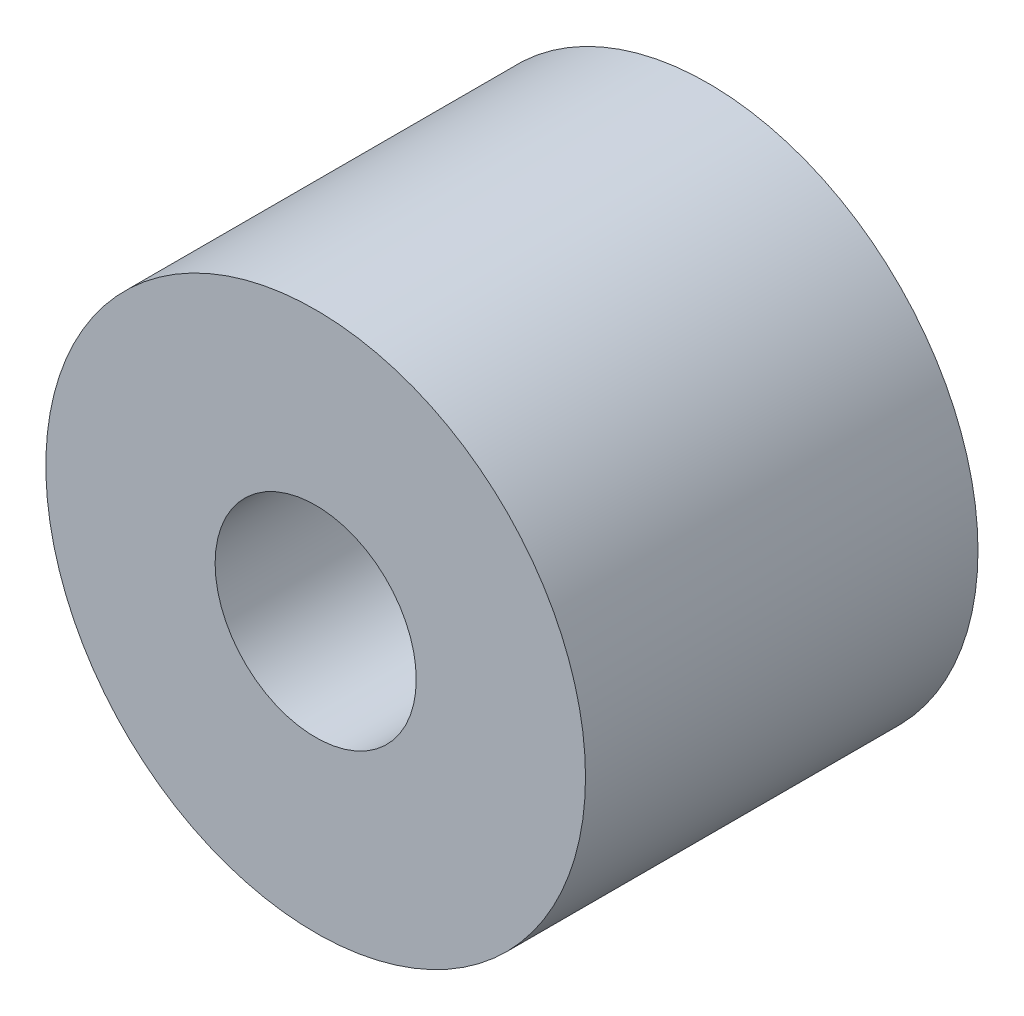
ISO-10303-21;
HEADER;
FILE_DESCRIPTION(('STEP AP214'),'2;1');
FILE_NAME('part.step','',(''),(''),'','','');
FILE_SCHEMA(('AUTOMOTIVE_DESIGN { 1 0 10303 214 1 1 1 1 }'));
ENDSEC;
DATA;
#1=APPLICATION_CONTEXT('core data for automotive mechanical design processes');
#2=APPLICATION_PROTOCOL_DEFINITION('international standard','automotive_design',2000,#1);
#3=PRODUCT_CONTEXT('',#1,'mechanical');
#4=PRODUCT('Part','Part','',(#3));
#5=PRODUCT_RELATED_PRODUCT_CATEGORY('part','',(#4));
#6=PRODUCT_DEFINITION_FORMATION('','',#4);
#7=PRODUCT_DEFINITION_CONTEXT('part definition',#1,'design');
#8=PRODUCT_DEFINITION('design','',#6,#7);
#9=PRODUCT_DEFINITION_SHAPE('','',#8);
#10=(LENGTH_UNIT() NAMED_UNIT(*) SI_UNIT(.MILLI.,.METRE.));
#11=(NAMED_UNIT(*) PLANE_ANGLE_UNIT() SI_UNIT($,.RADIAN.));
#12=(NAMED_UNIT(*) SI_UNIT($,.STERADIAN.) SOLID_ANGLE_UNIT());
#13=UNCERTAINTY_MEASURE_WITH_UNIT(LENGTH_MEASURE(1.E-05),#10,'distance_accuracy_value','');
#14=(GEOMETRIC_REPRESENTATION_CONTEXT(3) GLOBAL_UNCERTAINTY_ASSIGNED_CONTEXT((#13)) GLOBAL_UNIT_ASSIGNED_CONTEXT((#10,
#11,#12)) REPRESENTATION_CONTEXT('',''));
#15=CARTESIAN_POINT('',(0.,0.,0.));
#16=DIRECTION('',(0.,0.,1.));
#17=DIRECTION('',(1.,0.,0.));
#18=AXIS2_PLACEMENT_3D('',#15,#16,#17);
#19=CARTESIAN_POINT('',(0.,0.,8.));
#20=DIRECTION('',(0.,0.,1.));
#21=DIRECTION('',(1.,0.,0.));
#22=AXIS2_PLACEMENT_3D('',#19,#20,#21);
#23=PLANE('',#22);
#24=CARTESIAN_POINT('',(0.,0.,8.));
#25=DIRECTION('',(0.,0.,1.));
#26=DIRECTION('',(1.,0.,0.));
#27=AXIS2_PLACEMENT_3D('',#24,#25,#26);
#28=CIRCLE('',#27,5.5);
#29=CARTESIAN_POINT('',(5.5,0.,8.));
#30=VERTEX_POINT('',#29);
#31=EDGE_CURVE('E10',#30,#30,#28,.T.);
#32=ORIENTED_EDGE('',*,*,#31,.T.);
#33=EDGE_LOOP('',(#32));
#34=FACE_BOUND('',#33,.T.);
#35=CARTESIAN_POINT('',(0.,0.,8.));
#36=DIRECTION('',(0.,0.,1.));
#37=DIRECTION('',(1.,0.,0.));
#38=AXIS2_PLACEMENT_3D('',#35,#36,#37);
#39=CIRCLE('',#38,2.05);
#40=CARTESIAN_POINT('',(2.05,0.,8.));
#41=VERTEX_POINT('',#40);
#42=EDGE_CURVE('E42',#41,#41,#39,.T.);
#43=ORIENTED_EDGE('',*,*,#42,.F.);
#44=EDGE_LOOP('',(#43));
#45=FACE_BOUND('',#44,.T.);
#46=ADVANCED_FACE('F31',(#34,#45),#23,.T.);
#47=CARTESIAN_POINT('',(0.,0.,0.));
#48=DIRECTION('',(0.,0.,1.));
#49=DIRECTION('',(1.,0.,0.));
#50=AXIS2_PLACEMENT_3D('',#47,#48,#49);
#51=PLANE('',#50);
#52=CARTESIAN_POINT('',(0.,0.,0.));
#53=DIRECTION('',(0.,0.,1.));
#54=DIRECTION('',(1.,0.,0.));
#55=AXIS2_PLACEMENT_3D('',#52,#53,#54);
#56=CIRCLE('',#55,5.5);
#57=CARTESIAN_POINT('',(5.5,0.,0.));
#58=VERTEX_POINT('',#57);
#59=EDGE_CURVE('E35',#58,#58,#56,.T.);
#60=ORIENTED_EDGE('',*,*,#59,.F.);
#61=EDGE_LOOP('',(#60));
#62=FACE_BOUND('',#61,.T.);
#63=CARTESIAN_POINT('',(0.,0.,0.));
#64=DIRECTION('',(0.,0.,1.));
#65=DIRECTION('',(1.,0.,0.));
#66=AXIS2_PLACEMENT_3D('',#63,#64,#65);
#67=CIRCLE('',#66,2.05);
#68=CARTESIAN_POINT('',(2.05,0.,0.));
#69=VERTEX_POINT('',#68);
#70=EDGE_CURVE('E44',#69,#69,#67,.T.);
#71=ORIENTED_EDGE('',*,*,#70,.T.);
#72=EDGE_LOOP('',(#71));
#73=FACE_BOUND('',#72,.T.);
#74=ADVANCED_FACE('F54',(#62,#73),#51,.F.);
#75=CARTESIAN_POINT('',(0.,0.,8.));
#76=DIRECTION('',(0.,0.,-1.));
#77=DIRECTION('',(-1.,0.,0.));
#78=AXIS2_PLACEMENT_3D('',#75,#76,#77);
#79=CYLINDRICAL_SURFACE('',#78,5.5);
#80=ORIENTED_EDGE('',*,*,#31,.F.);
#81=EDGE_LOOP('',(#80));
#82=FACE_BOUND('',#81,.T.);
#83=ORIENTED_EDGE('',*,*,#59,.T.);
#84=EDGE_LOOP('',(#83));
#85=FACE_BOUND('',#84,.T.);
#86=ADVANCED_FACE('F33',(#82,#85),#79,.T.);
#87=CARTESIAN_POINT('',(0.,0.,8.));
#88=DIRECTION('',(0.,0.,-1.));
#89=DIRECTION('',(-1.,0.,0.));
#90=AXIS2_PLACEMENT_3D('',#87,#88,#89);
#91=CYLINDRICAL_SURFACE('',#90,2.05);
#92=ORIENTED_EDGE('',*,*,#42,.T.);
#93=EDGE_LOOP('',(#92));
#94=FACE_BOUND('',#93,.T.);
#95=ORIENTED_EDGE('',*,*,#70,.F.);
#96=EDGE_LOOP('',(#95));
#97=FACE_BOUND('',#96,.T.);
#98=ADVANCED_FACE('F50',(#94,#97),#91,.F.);
#99=CLOSED_SHELL('',(#46,#74,#86,#98));
#100=MANIFOLD_SOLID_BREP('B2',#99);
#101=ADVANCED_BREP_SHAPE_REPRESENTATION('',(#18,#100),#14);
#102=SHAPE_DEFINITION_REPRESENTATION(#9,#101);
ENDSEC;
END-ISO-10303-21;
